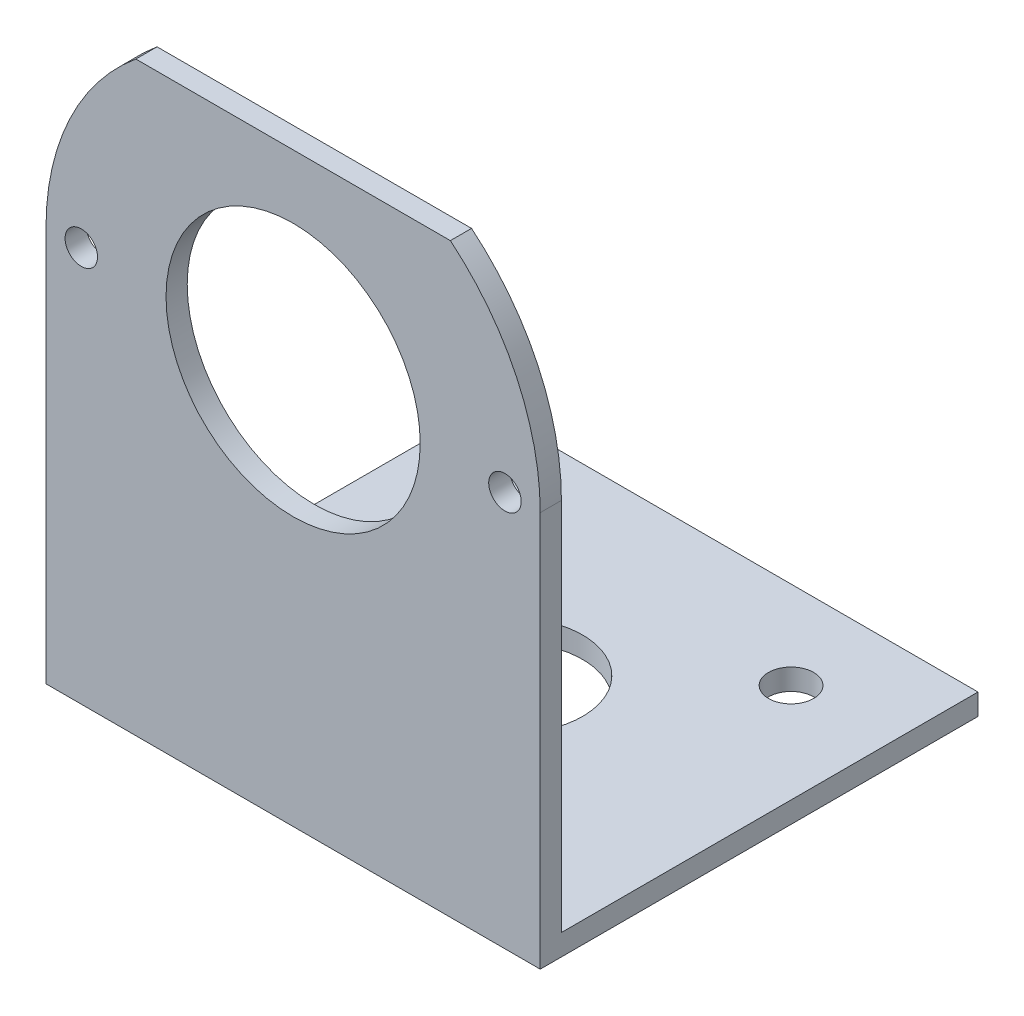
ISO-10303-21;
HEADER;
FILE_DESCRIPTION(('STEP AP214'),'2;1');
FILE_NAME('part.step','',(''),(''),'','','');
FILE_SCHEMA(('AUTOMOTIVE_DESIGN { 1 0 10303 214 1 1 1 1 }'));
ENDSEC;
DATA;
#1=APPLICATION_CONTEXT('core data for automotive mechanical design processes');
#2=APPLICATION_PROTOCOL_DEFINITION('international standard','automotive_design',2000,#1);
#3=PRODUCT_CONTEXT('',#1,'mechanical');
#4=PRODUCT('Part','Part','',(#3));
#5=PRODUCT_RELATED_PRODUCT_CATEGORY('part','',(#4));
#6=PRODUCT_DEFINITION_FORMATION('','',#4);
#7=PRODUCT_DEFINITION_CONTEXT('part definition',#1,'design');
#8=PRODUCT_DEFINITION('design','',#6,#7);
#9=PRODUCT_DEFINITION_SHAPE('','',#8);
#10=(LENGTH_UNIT() NAMED_UNIT(*) SI_UNIT(.MILLI.,.METRE.));
#11=(NAMED_UNIT(*) PLANE_ANGLE_UNIT() SI_UNIT($,.RADIAN.));
#12=(NAMED_UNIT(*) SI_UNIT($,.STERADIAN.) SOLID_ANGLE_UNIT());
#13=UNCERTAINTY_MEASURE_WITH_UNIT(LENGTH_MEASURE(1.E-05),#10,'distance_accuracy_value','');
#14=(GEOMETRIC_REPRESENTATION_CONTEXT(3) GLOBAL_UNCERTAINTY_ASSIGNED_CONTEXT((#13)) GLOBAL_UNIT_ASSIGNED_CONTEXT((#10,
#11,#12)) REPRESENTATION_CONTEXT('',''));
#15=CARTESIAN_POINT('',(0.,0.,0.));
#16=DIRECTION('',(0.,0.,1.));
#17=DIRECTION('',(1.,0.,0.));
#18=AXIS2_PLACEMENT_3D('',#15,#16,#17);
#19=CARTESIAN_POINT('',(-17.5,1.5,-15.5));
#20=DIRECTION('',(1.,0.,0.));
#21=DIRECTION('',(0.,0.,-1.));
#22=AXIS2_PLACEMENT_3D('',#19,#20,#21);
#23=PLANE('',#22);
#24=DIRECTION('',(0.,0.,1.));
#25=VECTOR('',#24,1.);
#26=CARTESIAN_POINT('',(-17.5,28.,-17.));
#27=LINE('',#26,#25);
#28=CARTESIAN_POINT('',(-17.5,28.,14.));
#29=VERTEX_POINT('',#28);
#30=CARTESIAN_POINT('',(-17.5,28.,15.5));
#31=VERTEX_POINT('',#30);
#32=EDGE_CURVE('E110',#29,#31,#27,.T.);
#33=ORIENTED_EDGE('',*,*,#32,.F.);
#34=DIRECTION('',(0.,-1.,0.));
#35=VECTOR('',#34,1.);
#36=CARTESIAN_POINT('',(-17.5,41.5,14.));
#37=LINE('',#36,#35);
#38=CARTESIAN_POINT('',(-17.5,1.5,14.));
#39=VERTEX_POINT('',#38);
#40=EDGE_CURVE('E184',#29,#39,#37,.T.);
#41=ORIENTED_EDGE('',*,*,#40,.T.);
#42=DIRECTION('',(0.,0.,1.));
#43=VECTOR('',#42,1.);
#44=CARTESIAN_POINT('',(-17.5,1.5,-15.5));
#45=LINE('',#44,#43);
#46=CARTESIAN_POINT('',(-17.5,1.5,-15.5));
#47=VERTEX_POINT('',#46);
#48=EDGE_CURVE('E143',#47,#39,#45,.T.);
#49=ORIENTED_EDGE('',*,*,#48,.F.);
#50=DIRECTION('',(0.,-1.,0.));
#51=VECTOR('',#50,1.);
#52=CARTESIAN_POINT('',(-17.5,1.5,-15.5));
#53=LINE('',#52,#51);
#54=CARTESIAN_POINT('',(-17.5,0.,-15.5));
#55=VERTEX_POINT('',#54);
#56=EDGE_CURVE('E136',#47,#55,#53,.T.);
#57=ORIENTED_EDGE('',*,*,#56,.T.);
#58=DIRECTION('',(0.,0.,1.));
#59=VECTOR('',#58,1.);
#60=CARTESIAN_POINT('',(-17.5,0.,-15.5));
#61=LINE('',#60,#59);
#62=CARTESIAN_POINT('',(-17.5,0.,15.5));
#63=VERTEX_POINT('',#62);
#64=EDGE_CURVE('E133',#55,#63,#61,.T.);
#65=ORIENTED_EDGE('',*,*,#64,.T.);
#66=DIRECTION('',(0.,-1.,0.));
#67=VECTOR('',#66,1.);
#68=CARTESIAN_POINT('',(-17.5,1.5,15.5));
#69=LINE('',#68,#67);
#70=EDGE_CURVE('E123',#31,#63,#69,.T.);
#71=ORIENTED_EDGE('',*,*,#70,.F.);
#72=EDGE_LOOP('',(#33,#41,#49,#57,#65,#71));
#73=FACE_BOUND('',#72,.T.);
#74=ADVANCED_FACE('F45',(#73),#23,.F.);
#75=CARTESIAN_POINT('',(-17.5,1.5,15.5));
#76=DIRECTION('',(0.,0.,-1.));
#77=DIRECTION('',(-1.,0.,0.));
#78=AXIS2_PLACEMENT_3D('',#75,#76,#77);
#79=PLANE('',#78);
#80=CARTESIAN_POINT('',(15.,28.,15.5));
#81=DIRECTION('',(0.,0.,1.));
#82=DIRECTION('',(1.,0.,0.));
#83=AXIS2_PLACEMENT_3D('',#80,#81,#82);
#84=CIRCLE('',#83,1.15);
#85=CARTESIAN_POINT('',(16.15,28.,15.5));
#86=VERTEX_POINT('',#85);
#87=EDGE_CURVE('E533',#86,#86,#84,.T.);
#88=ORIENTED_EDGE('',*,*,#87,.F.);
#89=EDGE_LOOP('',(#88));
#90=FACE_BOUND('',#89,.T.);
#91=CARTESIAN_POINT('',(-15.,28.,15.5));
#92=DIRECTION('',(0.,0.,1.));
#93=DIRECTION('',(1.,0.,0.));
#94=AXIS2_PLACEMENT_3D('',#91,#92,#93);
#95=CIRCLE('',#94,1.15);
#96=CARTESIAN_POINT('',(-13.85,28.,15.5));
#97=VERTEX_POINT('',#96);
#98=EDGE_CURVE('E535',#97,#97,#95,.T.);
#99=ORIENTED_EDGE('',*,*,#98,.F.);
#100=EDGE_LOOP('',(#99));
#101=FACE_BOUND('',#100,.T.);
#102=CARTESIAN_POINT('',(0.,28.,15.5));
#103=DIRECTION('',(0.,0.,1.));
#104=DIRECTION('',(1.,0.,0.));
#105=AXIS2_PLACEMENT_3D('',#102,#103,#104);
#106=CIRCLE('',#105,9.);
#107=CARTESIAN_POINT('',(9.,28.,15.5));
#108=VERTEX_POINT('',#107);
#109=EDGE_CURVE('E156',#108,#108,#106,.T.);
#110=ORIENTED_EDGE('',*,*,#109,.F.);
#111=EDGE_LOOP('',(#110));
#112=FACE_BOUND('',#111,.T.);
#113=CARTESIAN_POINT('',(0.,28.,15.5));
#114=DIRECTION('',(0.,0.,1.));
#115=DIRECTION('',(1.,0.,0.));
#116=AXIS2_PLACEMENT_3D('',#113,#114,#115);
#117=CIRCLE('',#116,17.5);
#118=CARTESIAN_POINT('',(-11.13552872566,41.5,15.5));
#119=VERTEX_POINT('',#118);
#120=EDGE_CURVE('E70',#119,#31,#117,.T.);
#121=ORIENTED_EDGE('',*,*,#120,.T.);
#122=ORIENTED_EDGE('',*,*,#70,.T.);
#123=DIRECTION('',(1.,0.,0.));
#124=VECTOR('',#123,1.);
#125=CARTESIAN_POINT('',(-17.5,0.,15.5));
#126=LINE('',#125,#124);
#127=CARTESIAN_POINT('',(17.5,0.,15.5));
#128=VERTEX_POINT('',#127);
#129=EDGE_CURVE('E238',#63,#128,#126,.T.);
#130=ORIENTED_EDGE('',*,*,#129,.T.);
#131=DIRECTION('',(0.,-1.,0.));
#132=VECTOR('',#131,1.);
#133=CARTESIAN_POINT('',(17.5,1.5,15.5));
#134=LINE('',#133,#132);
#135=CARTESIAN_POINT('',(17.5,28.,15.5));
#136=VERTEX_POINT('',#135);
#137=EDGE_CURVE('E137',#136,#128,#134,.T.);
#138=ORIENTED_EDGE('',*,*,#137,.F.);
#139=CARTESIAN_POINT('',(0.,28.,15.5));
#140=DIRECTION('',(0.,0.,1.));
#141=DIRECTION('',(1.,0.,0.));
#142=AXIS2_PLACEMENT_3D('',#139,#140,#141);
#143=CIRCLE('',#142,17.5);
#144=CARTESIAN_POINT('',(11.1355287256601,41.5,15.5));
#145=VERTEX_POINT('',#144);
#146=EDGE_CURVE('E163',#136,#145,#143,.T.);
#147=ORIENTED_EDGE('',*,*,#146,.T.);
#148=DIRECTION('',(1.,0.,0.));
#149=VECTOR('',#148,1.);
#150=CARTESIAN_POINT('',(-17.5,41.5,15.5));
#151=LINE('',#150,#149);
#152=EDGE_CURVE('E127',#119,#145,#151,.T.);
#153=ORIENTED_EDGE('',*,*,#152,.F.);
#154=EDGE_LOOP('',(#121,#122,#130,#138,#147,#153));
#155=FACE_BOUND('',#154,.T.);
#156=ADVANCED_FACE('F121',(#90,#101,#112,#155),#79,.F.);
#157=CARTESIAN_POINT('',(-17.5,41.5,14.));
#158=DIRECTION('',(0.,0.,1.));
#159=DIRECTION('',(1.,0.,0.));
#160=AXIS2_PLACEMENT_3D('',#157,#158,#159);
#161=PLANE('',#160);
#162=CARTESIAN_POINT('',(15.,28.,14.));
#163=DIRECTION('',(0.,0.,1.));
#164=DIRECTION('',(1.,0.,0.));
#165=AXIS2_PLACEMENT_3D('',#162,#163,#164);
#166=CIRCLE('',#165,1.15);
#167=CARTESIAN_POINT('',(16.15,28.,14.));
#168=VERTEX_POINT('',#167);
#169=EDGE_CURVE('E49',#168,#168,#166,.T.);
#170=ORIENTED_EDGE('',*,*,#169,.T.);
#171=EDGE_LOOP('',(#170));
#172=FACE_BOUND('',#171,.T.);
#173=CARTESIAN_POINT('',(-15.,28.,14.));
#174=DIRECTION('',(0.,0.,1.));
#175=DIRECTION('',(1.,0.,0.));
#176=AXIS2_PLACEMENT_3D('',#173,#174,#175);
#177=CIRCLE('',#176,1.15);
#178=CARTESIAN_POINT('',(-13.85,28.,14.));
#179=VERTEX_POINT('',#178);
#180=EDGE_CURVE('E155',#179,#179,#177,.T.);
#181=ORIENTED_EDGE('',*,*,#180,.T.);
#182=EDGE_LOOP('',(#181));
#183=FACE_BOUND('',#182,.T.);
#184=CARTESIAN_POINT('',(0.,28.,14.));
#185=DIRECTION('',(0.,0.,1.));
#186=DIRECTION('',(1.,0.,0.));
#187=AXIS2_PLACEMENT_3D('',#184,#185,#186);
#188=CIRCLE('',#187,9.);
#189=CARTESIAN_POINT('',(9.,28.,14.));
#190=VERTEX_POINT('',#189);
#191=EDGE_CURVE('E152',#190,#190,#188,.T.);
#192=ORIENTED_EDGE('',*,*,#191,.T.);
#193=EDGE_LOOP('',(#192));
#194=FACE_BOUND('',#193,.T.);
#195=CARTESIAN_POINT('',(0.,28.,14.));
#196=DIRECTION('',(0.,0.,1.));
#197=DIRECTION('',(1.,0.,0.));
#198=AXIS2_PLACEMENT_3D('',#195,#196,#197);
#199=CIRCLE('',#198,17.5);
#200=CARTESIAN_POINT('',(-11.13552872566,41.5,14.));
#201=VERTEX_POINT('',#200);
#202=EDGE_CURVE('E113',#201,#29,#199,.T.);
#203=ORIENTED_EDGE('',*,*,#202,.F.);
#204=DIRECTION('',(-1.,0.,0.));
#205=VECTOR('',#204,1.);
#206=CARTESIAN_POINT('',(-17.5,41.5,14.));
#207=LINE('',#206,#205);
#208=CARTESIAN_POINT('',(11.1355287256601,41.5,14.));
#209=VERTEX_POINT('',#208);
#210=EDGE_CURVE('E180',#209,#201,#207,.T.);
#211=ORIENTED_EDGE('',*,*,#210,.F.);
#212=CARTESIAN_POINT('',(0.,28.,14.));
#213=DIRECTION('',(0.,0.,1.));
#214=DIRECTION('',(1.,0.,0.));
#215=AXIS2_PLACEMENT_3D('',#212,#213,#214);
#216=CIRCLE('',#215,17.5);
#217=CARTESIAN_POINT('',(17.5,28.,14.));
#218=VERTEX_POINT('',#217);
#219=EDGE_CURVE('E63',#218,#209,#216,.T.);
#220=ORIENTED_EDGE('',*,*,#219,.F.);
#221=DIRECTION('',(0.,-1.,0.));
#222=VECTOR('',#221,1.);
#223=CARTESIAN_POINT('',(17.5,41.5,14.));
#224=LINE('',#223,#222);
#225=CARTESIAN_POINT('',(17.5,1.5,14.));
#226=VERTEX_POINT('',#225);
#227=EDGE_CURVE('E190',#218,#226,#224,.T.);
#228=ORIENTED_EDGE('',*,*,#227,.T.);
#229=DIRECTION('',(-1.,0.,0.));
#230=VECTOR('',#229,1.);
#231=CARTESIAN_POINT('',(-17.5,1.5,14.));
#232=LINE('',#231,#230);
#233=EDGE_CURVE('E177',#226,#39,#232,.T.);
#234=ORIENTED_EDGE('',*,*,#233,.T.);
#235=ORIENTED_EDGE('',*,*,#40,.F.);
#236=EDGE_LOOP('',(#203,#211,#220,#228,#234,#235));
#237=FACE_BOUND('',#236,.T.);
#238=ADVANCED_FACE('F263',(#172,#183,#194,#237),#161,.F.);
#239=CARTESIAN_POINT('',(0.,41.5,0.));
#240=DIRECTION('',(0.,-1.,0.));
#241=DIRECTION('',(0.,0.,-1.));
#242=AXIS2_PLACEMENT_3D('',#239,#240,#241);
#243=PLANE('',#242);
#244=DIRECTION('',(0.,0.,1.));
#245=VECTOR('',#244,1.);
#246=CARTESIAN_POINT('',(-11.13552872566,41.5,-17.));
#247=LINE('',#246,#245);
#248=EDGE_CURVE('E11',#119,#201,#247,.F.);
#249=ORIENTED_EDGE('',*,*,#248,.F.);
#250=ORIENTED_EDGE('',*,*,#152,.T.);
#251=DIRECTION('',(0.,0.,1.));
#252=VECTOR('',#251,1.);
#253=CARTESIAN_POINT('',(11.1355287256601,41.5,-17.));
#254=LINE('',#253,#252);
#255=EDGE_CURVE('E55',#209,#145,#254,.T.);
#256=ORIENTED_EDGE('',*,*,#255,.F.);
#257=ORIENTED_EDGE('',*,*,#210,.T.);
#258=EDGE_LOOP('',(#249,#250,#256,#257));
#259=FACE_BOUND('',#258,.T.);
#260=ADVANCED_FACE('F266',(#259),#243,.F.);
#261=CARTESIAN_POINT('',(0.,1.5,0.));
#262=DIRECTION('',(0.,1.,0.));
#263=DIRECTION('',(0.,0.,1.));
#264=AXIS2_PLACEMENT_3D('',#261,#262,#263);
#265=PLANE('',#264);
#266=ORIENTED_EDGE('',*,*,#233,.F.);
#267=DIRECTION('',(0.,0.,-1.));
#268=VECTOR('',#267,1.);
#269=CARTESIAN_POINT('',(17.5,1.5,-15.5));
#270=LINE('',#269,#268);
#271=CARTESIAN_POINT('',(17.5,1.5,-15.5));
#272=VERTEX_POINT('',#271);
#273=EDGE_CURVE('E234',#226,#272,#270,.T.);
#274=ORIENTED_EDGE('',*,*,#273,.T.);
#275=DIRECTION('',(-1.,0.,0.));
#276=VECTOR('',#275,1.);
#277=CARTESIAN_POINT('',(-17.5,1.5,-15.5));
#278=LINE('',#277,#276);
#279=EDGE_CURVE('E237',#272,#47,#278,.T.);
#280=ORIENTED_EDGE('',*,*,#279,.T.);
#281=ORIENTED_EDGE('',*,*,#48,.T.);
#282=EDGE_LOOP('',(#266,#274,#280,#281));
#283=FACE_BOUND('',#282,.T.);
#284=CARTESIAN_POINT('',(10.4802345224243,1.5,9.28249343414722));
#285=DIRECTION('',(0.,1.,0.));
#286=DIRECTION('',(0.,0.,1.));
#287=AXIS2_PLACEMENT_3D('',#284,#285,#286);
#288=CIRCLE('',#287,1.6);
#289=CARTESIAN_POINT('',(10.4802345224243,1.5,10.8824934341472));
#290=VERTEX_POINT('',#289);
#291=EDGE_CURVE('E202',#290,#290,#288,.T.);
#292=ORIENTED_EDGE('',*,*,#291,.F.);
#293=EDGE_LOOP('',(#292));
#294=FACE_BOUND('',#293,.T.);
#295=CARTESIAN_POINT('',(0.,1.5,0.));
#296=DIRECTION('',(0.,1.,0.));
#297=DIRECTION('',(0.,0.,1.));
#298=AXIS2_PLACEMENT_3D('',#295,#296,#297);
#299=CIRCLE('',#298,5.);
#300=CARTESIAN_POINT('',(0.,1.5,5.));
#301=VERTEX_POINT('',#300);
#302=EDGE_CURVE('E218',#301,#301,#299,.T.);
#303=ORIENTED_EDGE('',*,*,#302,.F.);
#304=EDGE_LOOP('',(#303));
#305=FACE_BOUND('',#304,.T.);
#306=CARTESIAN_POINT('',(-10.4802345224243,1.5,-9.28249343414722));
#307=DIRECTION('',(0.,1.,0.));
#308=DIRECTION('',(0.,0.,1.));
#309=AXIS2_PLACEMENT_3D('',#306,#307,#308);
#310=CIRCLE('',#309,1.6);
#311=CARTESIAN_POINT('',(-10.4802345224243,1.5,-7.68249343414722));
#312=VERTEX_POINT('',#311);
#313=EDGE_CURVE('E226',#312,#312,#310,.T.);
#314=ORIENTED_EDGE('',*,*,#313,.F.);
#315=EDGE_LOOP('',(#314));
#316=FACE_BOUND('',#315,.T.);
#317=CARTESIAN_POINT('',(10.4802345224243,1.5,-9.28249343414722));
#318=DIRECTION('',(0.,1.,0.));
#319=DIRECTION('',(0.,0.,-1.));
#320=AXIS2_PLACEMENT_3D('',#317,#318,#319);
#321=CIRCLE('',#320,1.6);
#322=CARTESIAN_POINT('',(10.4802345224243,1.5,-10.8824934341472));
#323=VERTEX_POINT('',#322);
#324=EDGE_CURVE('E210',#323,#323,#321,.T.);
#325=ORIENTED_EDGE('',*,*,#324,.F.);
#326=EDGE_LOOP('',(#325));
#327=FACE_BOUND('',#326,.T.);
#328=CARTESIAN_POINT('',(-10.4802345224243,1.5,9.28249343414722));
#329=DIRECTION('',(0.,1.,0.));
#330=DIRECTION('',(0.,0.,-1.));
#331=AXIS2_PLACEMENT_3D('',#328,#329,#330);
#332=CIRCLE('',#331,1.6);
#333=CARTESIAN_POINT('',(-10.4802345224243,1.5,7.68249343414722));
#334=VERTEX_POINT('',#333);
#335=EDGE_CURVE('E194',#334,#334,#332,.T.);
#336=ORIENTED_EDGE('',*,*,#335,.F.);
#337=EDGE_LOOP('',(#336));
#338=FACE_BOUND('',#337,.T.);
#339=ADVANCED_FACE('F268',(#283,#294,#305,#316,#327,#338),#265,.T.);
#340=CARTESIAN_POINT('',(0.,0.,0.));
#341=DIRECTION('',(0.,1.,0.));
#342=DIRECTION('',(0.,0.,1.));
#343=AXIS2_PLACEMENT_3D('',#340,#341,#342);
#344=PLANE('',#343);
#345=DIRECTION('',(0.,0.,-1.));
#346=VECTOR('',#345,1.);
#347=CARTESIAN_POINT('',(17.5,0.,-15.5));
#348=LINE('',#347,#346);
#349=CARTESIAN_POINT('',(17.5,0.,-15.5));
#350=VERTEX_POINT('',#349);
#351=EDGE_CURVE('E230',#128,#350,#348,.T.);
#352=ORIENTED_EDGE('',*,*,#351,.F.);
#353=ORIENTED_EDGE('',*,*,#129,.F.);
#354=ORIENTED_EDGE('',*,*,#64,.F.);
#355=DIRECTION('',(-1.,0.,0.));
#356=VECTOR('',#355,1.);
#357=CARTESIAN_POINT('',(-17.5,0.,-15.5));
#358=LINE('',#357,#356);
#359=EDGE_CURVE('E247',#350,#55,#358,.T.);
#360=ORIENTED_EDGE('',*,*,#359,.F.);
#361=EDGE_LOOP('',(#352,#353,#354,#360));
#362=FACE_BOUND('',#361,.T.);
#363=CARTESIAN_POINT('',(-10.4802345224243,0.,-9.28249343414722));
#364=DIRECTION('',(0.,1.,0.));
#365=DIRECTION('',(0.,0.,1.));
#366=AXIS2_PLACEMENT_3D('',#363,#364,#365);
#367=CIRCLE('',#366,1.6);
#368=CARTESIAN_POINT('',(-10.4802345224243,0.,-7.68249343414722));
#369=VERTEX_POINT('',#368);
#370=EDGE_CURVE('E222',#369,#369,#367,.T.);
#371=ORIENTED_EDGE('',*,*,#370,.T.);
#372=EDGE_LOOP('',(#371));
#373=FACE_BOUND('',#372,.T.);
#374=CARTESIAN_POINT('',(0.,0.,0.));
#375=DIRECTION('',(0.,1.,0.));
#376=DIRECTION('',(0.,0.,1.));
#377=AXIS2_PLACEMENT_3D('',#374,#375,#376);
#378=CIRCLE('',#377,5.);
#379=CARTESIAN_POINT('',(0.,0.,5.));
#380=VERTEX_POINT('',#379);
#381=EDGE_CURVE('E214',#380,#380,#378,.T.);
#382=ORIENTED_EDGE('',*,*,#381,.T.);
#383=EDGE_LOOP('',(#382));
#384=FACE_BOUND('',#383,.T.);
#385=CARTESIAN_POINT('',(10.4802345224243,0.,-9.28249343414722));
#386=DIRECTION('',(0.,1.,0.));
#387=DIRECTION('',(0.,0.,-1.));
#388=AXIS2_PLACEMENT_3D('',#385,#386,#387);
#389=CIRCLE('',#388,1.6);
#390=CARTESIAN_POINT('',(10.4802345224243,0.,-10.8824934341472));
#391=VERTEX_POINT('',#390);
#392=EDGE_CURVE('E206',#391,#391,#389,.T.);
#393=ORIENTED_EDGE('',*,*,#392,.T.);
#394=EDGE_LOOP('',(#393));
#395=FACE_BOUND('',#394,.T.);
#396=CARTESIAN_POINT('',(10.4802345224243,0.,9.28249343414722));
#397=DIRECTION('',(0.,1.,0.));
#398=DIRECTION('',(0.,0.,1.));
#399=AXIS2_PLACEMENT_3D('',#396,#397,#398);
#400=CIRCLE('',#399,1.6);
#401=CARTESIAN_POINT('',(10.4802345224243,0.,10.8824934341472));
#402=VERTEX_POINT('',#401);
#403=EDGE_CURVE('E198',#402,#402,#400,.T.);
#404=ORIENTED_EDGE('',*,*,#403,.T.);
#405=EDGE_LOOP('',(#404));
#406=FACE_BOUND('',#405,.T.);
#407=CARTESIAN_POINT('',(-10.4802345224243,0.,9.28249343414722));
#408=DIRECTION('',(0.,1.,0.));
#409=DIRECTION('',(0.,0.,-1.));
#410=AXIS2_PLACEMENT_3D('',#407,#408,#409);
#411=CIRCLE('',#410,1.6);
#412=CARTESIAN_POINT('',(-10.4802345224243,0.,7.68249343414722));
#413=VERTEX_POINT('',#412);
#414=EDGE_CURVE('E193',#413,#413,#411,.T.);
#415=ORIENTED_EDGE('',*,*,#414,.T.);
#416=EDGE_LOOP('',(#415));
#417=FACE_BOUND('',#416,.T.);
#418=ADVANCED_FACE('F254',(#362,#373,#384,#395,#406,#417),#344,.F.);
#419=CARTESIAN_POINT('',(17.5,1.5,-15.5));
#420=DIRECTION('',(-1.,0.,0.));
#421=DIRECTION('',(0.,0.,1.));
#422=AXIS2_PLACEMENT_3D('',#419,#420,#421);
#423=PLANE('',#422);
#424=ORIENTED_EDGE('',*,*,#227,.F.);
#425=DIRECTION('',(0.,0.,1.));
#426=VECTOR('',#425,1.);
#427=CARTESIAN_POINT('',(17.5,28.,-17.));
#428=LINE('',#427,#426);
#429=EDGE_CURVE('E129',#218,#136,#428,.T.);
#430=ORIENTED_EDGE('',*,*,#429,.T.);
#431=ORIENTED_EDGE('',*,*,#137,.T.);
#432=ORIENTED_EDGE('',*,*,#351,.T.);
#433=DIRECTION('',(0.,-1.,0.));
#434=VECTOR('',#433,1.);
#435=CARTESIAN_POINT('',(17.5,1.5,-15.5));
#436=LINE('',#435,#434);
#437=EDGE_CURVE('E141',#272,#350,#436,.T.);
#438=ORIENTED_EDGE('',*,*,#437,.F.);
#439=ORIENTED_EDGE('',*,*,#273,.F.);
#440=EDGE_LOOP('',(#424,#430,#431,#432,#438,#439));
#441=FACE_BOUND('',#440,.T.);
#442=ADVANCED_FACE('F47',(#441),#423,.F.);
#443=CARTESIAN_POINT('',(-17.5,1.5,-15.5));
#444=DIRECTION('',(0.,0.,1.));
#445=DIRECTION('',(1.,0.,0.));
#446=AXIS2_PLACEMENT_3D('',#443,#444,#445);
#447=PLANE('',#446);
#448=ORIENTED_EDGE('',*,*,#359,.T.);
#449=ORIENTED_EDGE('',*,*,#56,.F.);
#450=ORIENTED_EDGE('',*,*,#279,.F.);
#451=ORIENTED_EDGE('',*,*,#437,.T.);
#452=EDGE_LOOP('',(#448,#449,#450,#451));
#453=FACE_BOUND('',#452,.T.);
#454=ADVANCED_FACE('F286',(#453),#447,.F.);
#455=CARTESIAN_POINT('',(-10.4802345224243,1.5,-9.28249343414722));
#456=DIRECTION('',(0.,-1.,0.));
#457=DIRECTION('',(0.,0.,-1.));
#458=AXIS2_PLACEMENT_3D('',#455,#456,#457);
#459=CYLINDRICAL_SURFACE('',#458,1.6);
#460=ORIENTED_EDGE('',*,*,#313,.T.);
#461=EDGE_LOOP('',(#460));
#462=FACE_BOUND('',#461,.T.);
#463=ORIENTED_EDGE('',*,*,#370,.F.);
#464=EDGE_LOOP('',(#463));
#465=FACE_BOUND('',#464,.T.);
#466=ADVANCED_FACE('F288',(#462,#465),#459,.F.);
#467=CARTESIAN_POINT('',(0.,1.5,0.));
#468=DIRECTION('',(0.,-1.,0.));
#469=DIRECTION('',(0.,0.,-1.));
#470=AXIS2_PLACEMENT_3D('',#467,#468,#469);
#471=CYLINDRICAL_SURFACE('',#470,5.);
#472=ORIENTED_EDGE('',*,*,#302,.T.);
#473=EDGE_LOOP('',(#472));
#474=FACE_BOUND('',#473,.T.);
#475=ORIENTED_EDGE('',*,*,#381,.F.);
#476=EDGE_LOOP('',(#475));
#477=FACE_BOUND('',#476,.T.);
#478=ADVANCED_FACE('F294',(#474,#477),#471,.F.);
#479=CARTESIAN_POINT('',(10.4802345224243,1.5,-9.28249343414722));
#480=DIRECTION('',(0.,-1.,0.));
#481=DIRECTION('',(0.,0.,-1.));
#482=AXIS2_PLACEMENT_3D('',#479,#480,#481);
#483=CYLINDRICAL_SURFACE('',#482,1.6);
#484=ORIENTED_EDGE('',*,*,#324,.T.);
#485=EDGE_LOOP('',(#484));
#486=FACE_BOUND('',#485,.T.);
#487=ORIENTED_EDGE('',*,*,#392,.F.);
#488=EDGE_LOOP('',(#487));
#489=FACE_BOUND('',#488,.T.);
#490=ADVANCED_FACE('F324',(#486,#489),#483,.F.);
#491=CARTESIAN_POINT('',(10.4802345224243,1.5,9.28249343414722));
#492=DIRECTION('',(0.,-1.,0.));
#493=DIRECTION('',(0.,0.,-1.));
#494=AXIS2_PLACEMENT_3D('',#491,#492,#493);
#495=CYLINDRICAL_SURFACE('',#494,1.6);
#496=ORIENTED_EDGE('',*,*,#291,.T.);
#497=EDGE_LOOP('',(#496));
#498=FACE_BOUND('',#497,.T.);
#499=ORIENTED_EDGE('',*,*,#403,.F.);
#500=EDGE_LOOP('',(#499));
#501=FACE_BOUND('',#500,.T.);
#502=ADVANCED_FACE('F314',(#498,#501),#495,.F.);
#503=CARTESIAN_POINT('',(-10.4802345224243,1.5,9.28249343414722));
#504=DIRECTION('',(0.,-1.,0.));
#505=DIRECTION('',(0.,0.,-1.));
#506=AXIS2_PLACEMENT_3D('',#503,#504,#505);
#507=CYLINDRICAL_SURFACE('',#506,1.6);
#508=ORIENTED_EDGE('',*,*,#335,.T.);
#509=EDGE_LOOP('',(#508));
#510=FACE_BOUND('',#509,.T.);
#511=ORIENTED_EDGE('',*,*,#414,.F.);
#512=EDGE_LOOP('',(#511));
#513=FACE_BOUND('',#512,.T.);
#514=ADVANCED_FACE('F311',(#510,#513),#507,.F.);
#515=CARTESIAN_POINT('',(0.,28.,-17.));
#516=DIRECTION('',(0.,0.,1.));
#517=DIRECTION('',(1.,0.,0.));
#518=AXIS2_PLACEMENT_3D('',#515,#516,#517);
#519=CYLINDRICAL_SURFACE('',#518,17.5);
#520=ORIENTED_EDGE('',*,*,#219,.T.);
#521=ORIENTED_EDGE('',*,*,#255,.T.);
#522=ORIENTED_EDGE('',*,*,#146,.F.);
#523=ORIENTED_EDGE('',*,*,#429,.F.);
#524=EDGE_LOOP('',(#520,#521,#522,#523));
#525=FACE_BOUND('',#524,.T.);
#526=ADVANCED_FACE('F260',(#525),#519,.T.);
#527=CARTESIAN_POINT('',(0.,28.,-17.));
#528=DIRECTION('',(0.,0.,1.));
#529=DIRECTION('',(1.,0.,0.));
#530=AXIS2_PLACEMENT_3D('',#527,#528,#529);
#531=CYLINDRICAL_SURFACE('',#530,17.5);
#532=ORIENTED_EDGE('',*,*,#202,.T.);
#533=ORIENTED_EDGE('',*,*,#32,.T.);
#534=ORIENTED_EDGE('',*,*,#120,.F.);
#535=ORIENTED_EDGE('',*,*,#248,.T.);
#536=EDGE_LOOP('',(#532,#533,#534,#535));
#537=FACE_BOUND('',#536,.T.);
#538=ADVANCED_FACE('F111',(#537),#531,.T.);
#539=CARTESIAN_POINT('',(0.,28.,-17.));
#540=DIRECTION('',(0.,0.,1.));
#541=DIRECTION('',(1.,0.,0.));
#542=AXIS2_PLACEMENT_3D('',#539,#540,#541);
#543=CYLINDRICAL_SURFACE('',#542,9.);
#544=ORIENTED_EDGE('',*,*,#109,.T.);
#545=EDGE_LOOP('',(#544));
#546=FACE_BOUND('',#545,.T.);
#547=ORIENTED_EDGE('',*,*,#191,.F.);
#548=EDGE_LOOP('',(#547));
#549=FACE_BOUND('',#548,.T.);
#550=ADVANCED_FACE('F353',(#546,#549),#543,.F.);
#551=CARTESIAN_POINT('',(-15.,28.,-17.));
#552=DIRECTION('',(0.,0.,1.));
#553=DIRECTION('',(1.,0.,0.));
#554=AXIS2_PLACEMENT_3D('',#551,#552,#553);
#555=CYLINDRICAL_SURFACE('',#554,1.15);
#556=ORIENTED_EDGE('',*,*,#98,.T.);
#557=EDGE_LOOP('',(#556));
#558=FACE_BOUND('',#557,.T.);
#559=ORIENTED_EDGE('',*,*,#180,.F.);
#560=EDGE_LOOP('',(#559));
#561=FACE_BOUND('',#560,.T.);
#562=ADVANCED_FACE('F360',(#558,#561),#555,.F.);
#563=CARTESIAN_POINT('',(15.,28.,-17.));
#564=DIRECTION('',(0.,0.,1.));
#565=DIRECTION('',(1.,0.,0.));
#566=AXIS2_PLACEMENT_3D('',#563,#564,#565);
#567=CYLINDRICAL_SURFACE('',#566,1.15);
#568=ORIENTED_EDGE('',*,*,#87,.T.);
#569=EDGE_LOOP('',(#568));
#570=FACE_BOUND('',#569,.T.);
#571=ORIENTED_EDGE('',*,*,#169,.F.);
#572=EDGE_LOOP('',(#571));
#573=FACE_BOUND('',#572,.T.);
#574=ADVANCED_FACE('F368',(#570,#573),#567,.F.);
#575=CLOSED_SHELL('',(#74,#156,#238,#260,#339,#418,#442,#454,#466,#478,#490,#502,#514,#526,#538,
#550,#562,#574));
#576=MANIFOLD_SOLID_BREP('B2',#575);
#577=ADVANCED_BREP_SHAPE_REPRESENTATION('',(#18,#576),#14);
#578=SHAPE_DEFINITION_REPRESENTATION(#9,#577);
ENDSEC;
END-ISO-10303-21;
